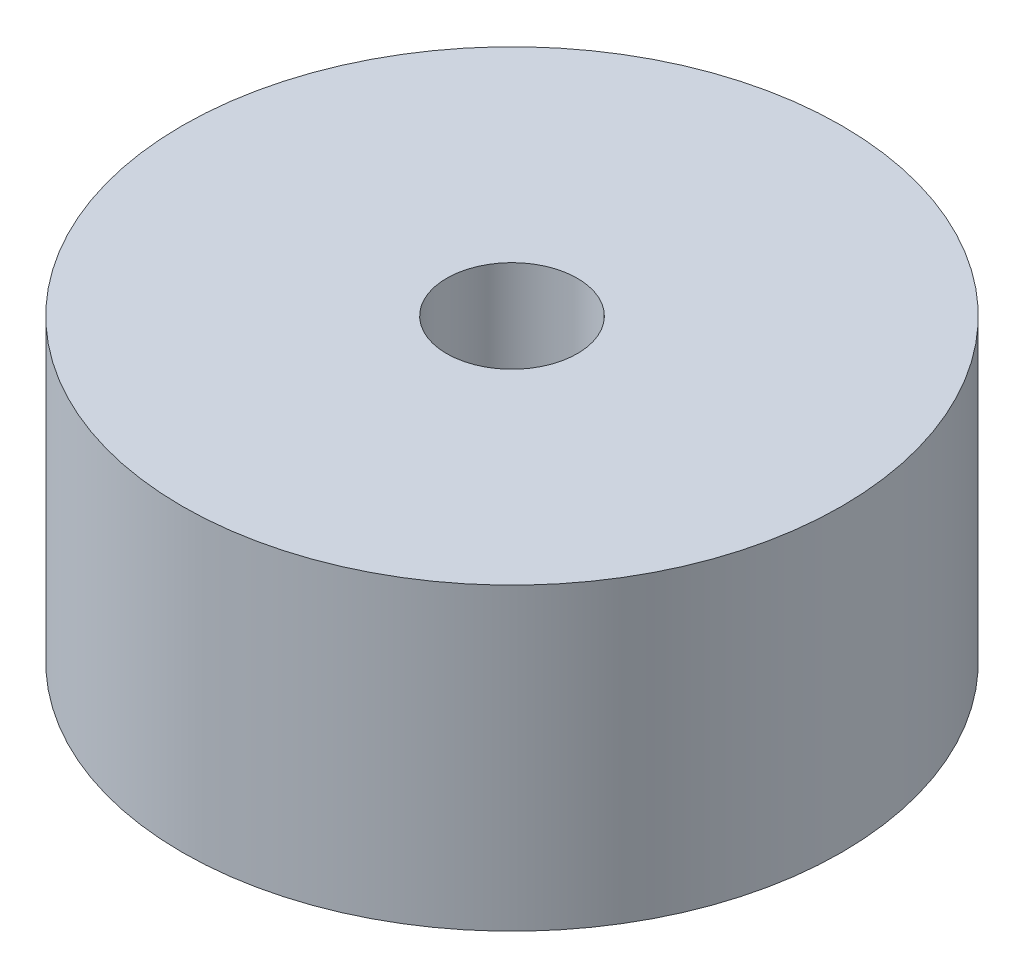
ISO-10303-21;
HEADER;
FILE_DESCRIPTION(('STEP AP214'),'2;1');
FILE_NAME('part.step','',(''),(''),'','','');
FILE_SCHEMA(('AUTOMOTIVE_DESIGN { 1 0 10303 214 1 1 1 1 }'));
ENDSEC;
DATA;
#1=APPLICATION_CONTEXT('core data for automotive mechanical design processes');
#2=APPLICATION_PROTOCOL_DEFINITION('international standard','automotive_design',2000,#1);
#3=PRODUCT_CONTEXT('',#1,'mechanical');
#4=PRODUCT('Part','Part','',(#3));
#5=PRODUCT_RELATED_PRODUCT_CATEGORY('part','',(#4));
#6=PRODUCT_DEFINITION_FORMATION('','',#4);
#7=PRODUCT_DEFINITION_CONTEXT('part definition',#1,'design');
#8=PRODUCT_DEFINITION('design','',#6,#7);
#9=PRODUCT_DEFINITION_SHAPE('','',#8);
#10=(LENGTH_UNIT() NAMED_UNIT(*) SI_UNIT(.MILLI.,.METRE.));
#11=(NAMED_UNIT(*) PLANE_ANGLE_UNIT() SI_UNIT($,.RADIAN.));
#12=(NAMED_UNIT(*) SI_UNIT($,.STERADIAN.) SOLID_ANGLE_UNIT());
#13=UNCERTAINTY_MEASURE_WITH_UNIT(LENGTH_MEASURE(1.E-05),#10,'distance_accuracy_value','');
#14=(GEOMETRIC_REPRESENTATION_CONTEXT(3) GLOBAL_UNCERTAINTY_ASSIGNED_CONTEXT((#13)) GLOBAL_UNIT_ASSIGNED_CONTEXT((#10,
#11,#12)) REPRESENTATION_CONTEXT('',''));
#15=CARTESIAN_POINT('',(0.,0.,0.));
#16=DIRECTION('',(0.,0.,1.));
#17=DIRECTION('',(1.,0.,0.));
#18=AXIS2_PLACEMENT_3D('',#15,#16,#17);
#19=CARTESIAN_POINT('',(0.,5.,0.));
#20=DIRECTION('',(0.,1.,0.));
#21=DIRECTION('',(0.,0.,1.));
#22=AXIS2_PLACEMENT_3D('',#19,#20,#21);
#23=PLANE('',#22);
#24=CARTESIAN_POINT('',(0.,5.,0.));
#25=DIRECTION('',(0.,1.,0.));
#26=DIRECTION('',(0.,0.,1.));
#27=AXIS2_PLACEMENT_3D('',#24,#25,#26);
#28=CIRCLE('',#27,5.5);
#29=CARTESIAN_POINT('',(0.,5.,5.5));
#30=VERTEX_POINT('',#29);
#31=EDGE_CURVE('E10',#30,#30,#28,.T.);
#32=ORIENTED_EDGE('',*,*,#31,.T.);
#33=EDGE_LOOP('',(#32));
#34=FACE_BOUND('',#33,.T.);
#35=CARTESIAN_POINT('',(0.,5.,0.));
#36=DIRECTION('',(0.,1.,0.));
#37=DIRECTION('',(0.,0.,1.));
#38=AXIS2_PLACEMENT_3D('',#35,#36,#37);
#39=CIRCLE('',#38,1.09);
#40=CARTESIAN_POINT('',(0.,5.,1.09));
#41=VERTEX_POINT('',#40);
#42=EDGE_CURVE('E42',#41,#41,#39,.T.);
#43=ORIENTED_EDGE('',*,*,#42,.F.);
#44=EDGE_LOOP('',(#43));
#45=FACE_BOUND('',#44,.T.);
#46=ADVANCED_FACE('F31',(#34,#45),#23,.T.);
#47=CARTESIAN_POINT('',(0.,0.,0.));
#48=DIRECTION('',(0.,1.,0.));
#49=DIRECTION('',(0.,0.,1.));
#50=AXIS2_PLACEMENT_3D('',#47,#48,#49);
#51=PLANE('',#50);
#52=CARTESIAN_POINT('',(0.,0.,0.));
#53=DIRECTION('',(0.,1.,0.));
#54=DIRECTION('',(0.,0.,1.));
#55=AXIS2_PLACEMENT_3D('',#52,#53,#54);
#56=CIRCLE('',#55,5.5);
#57=CARTESIAN_POINT('',(0.,0.,5.5));
#58=VERTEX_POINT('',#57);
#59=EDGE_CURVE('E35',#58,#58,#56,.T.);
#60=ORIENTED_EDGE('',*,*,#59,.F.);
#61=EDGE_LOOP('',(#60));
#62=FACE_BOUND('',#61,.T.);
#63=CARTESIAN_POINT('',(0.,0.,0.));
#64=DIRECTION('',(0.,1.,0.));
#65=DIRECTION('',(0.,0.,1.));
#66=AXIS2_PLACEMENT_3D('',#63,#64,#65);
#67=CIRCLE('',#66,1.09);
#68=CARTESIAN_POINT('',(0.,0.,1.09));
#69=VERTEX_POINT('',#68);
#70=EDGE_CURVE('E44',#69,#69,#67,.T.);
#71=ORIENTED_EDGE('',*,*,#70,.T.);
#72=EDGE_LOOP('',(#71));
#73=FACE_BOUND('',#72,.T.);
#74=ADVANCED_FACE('F54',(#62,#73),#51,.F.);
#75=CARTESIAN_POINT('',(0.,5.,0.));
#76=DIRECTION('',(0.,-1.,0.));
#77=DIRECTION('',(0.,0.,-1.));
#78=AXIS2_PLACEMENT_3D('',#75,#76,#77);
#79=CYLINDRICAL_SURFACE('',#78,5.5);
#80=ORIENTED_EDGE('',*,*,#31,.F.);
#81=EDGE_LOOP('',(#80));
#82=FACE_BOUND('',#81,.T.);
#83=ORIENTED_EDGE('',*,*,#59,.T.);
#84=EDGE_LOOP('',(#83));
#85=FACE_BOUND('',#84,.T.);
#86=ADVANCED_FACE('F33',(#82,#85),#79,.T.);
#87=CARTESIAN_POINT('',(0.,5.,0.));
#88=DIRECTION('',(0.,-1.,0.));
#89=DIRECTION('',(0.,0.,-1.));
#90=AXIS2_PLACEMENT_3D('',#87,#88,#89);
#91=CYLINDRICAL_SURFACE('',#90,1.09);
#92=ORIENTED_EDGE('',*,*,#42,.T.);
#93=EDGE_LOOP('',(#92));
#94=FACE_BOUND('',#93,.T.);
#95=ORIENTED_EDGE('',*,*,#70,.F.);
#96=EDGE_LOOP('',(#95));
#97=FACE_BOUND('',#96,.T.);
#98=ADVANCED_FACE('F50',(#94,#97),#91,.F.);
#99=CLOSED_SHELL('',(#46,#74,#86,#98));
#100=MANIFOLD_SOLID_BREP('B2',#99);
#101=ADVANCED_BREP_SHAPE_REPRESENTATION('',(#18,#100),#14);
#102=SHAPE_DEFINITION_REPRESENTATION(#9,#101);
ENDSEC;
END-ISO-10303-21;
